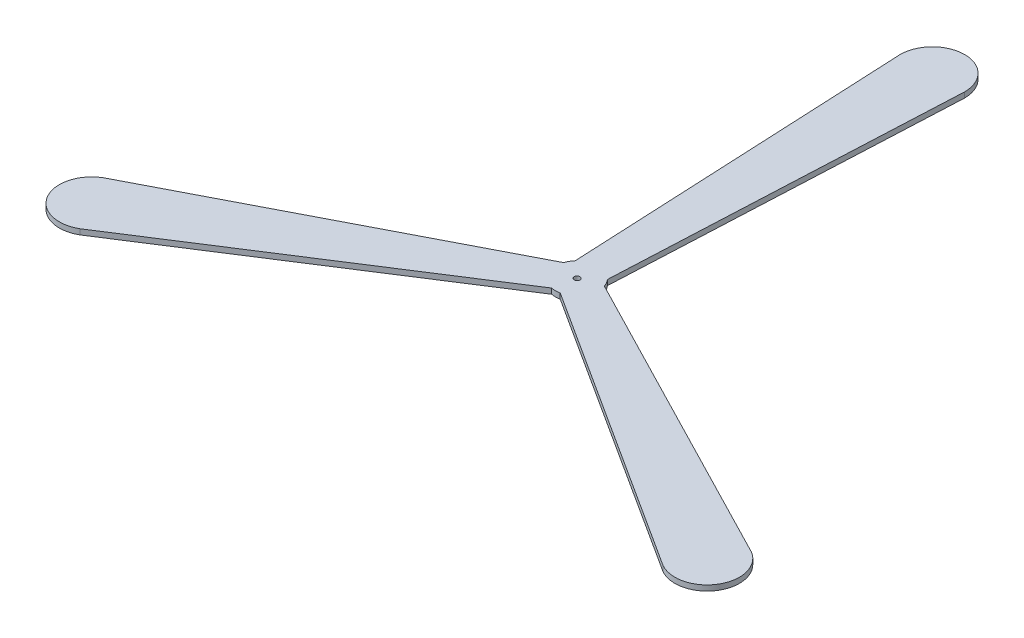
ISO-10303-21;
HEADER;
FILE_DESCRIPTION(('STEP AP214'),'2;1');
FILE_NAME('part.step','',(''),(''),'','','');
FILE_SCHEMA(('AUTOMOTIVE_DESIGN { 1 0 10303 214 1 1 1 1 }'));
ENDSEC;
DATA;
#1=APPLICATION_CONTEXT('core data for automotive mechanical design processes');
#2=APPLICATION_PROTOCOL_DEFINITION('international standard','automotive_design',2000,#1);
#3=PRODUCT_CONTEXT('',#1,'mechanical');
#4=PRODUCT('Part','Part','',(#3));
#5=PRODUCT_RELATED_PRODUCT_CATEGORY('part','',(#4));
#6=PRODUCT_DEFINITION_FORMATION('','',#4);
#7=PRODUCT_DEFINITION_CONTEXT('part definition',#1,'design');
#8=PRODUCT_DEFINITION('design','',#6,#7);
#9=PRODUCT_DEFINITION_SHAPE('','',#8);
#10=(LENGTH_UNIT() NAMED_UNIT(*) SI_UNIT(.MILLI.,.METRE.));
#11=(NAMED_UNIT(*) PLANE_ANGLE_UNIT() SI_UNIT($,.RADIAN.));
#12=(NAMED_UNIT(*) SI_UNIT($,.STERADIAN.) SOLID_ANGLE_UNIT());
#13=UNCERTAINTY_MEASURE_WITH_UNIT(LENGTH_MEASURE(1.E-05),#10,'distance_accuracy_value','');
#14=(GEOMETRIC_REPRESENTATION_CONTEXT(3) GLOBAL_UNCERTAINTY_ASSIGNED_CONTEXT((#13)) GLOBAL_UNIT_ASSIGNED_CONTEXT((#10,
#11,#12)) REPRESENTATION_CONTEXT('',''));
#15=CARTESIAN_POINT('',(0.,0.,0.));
#16=DIRECTION('',(0.,0.,1.));
#17=DIRECTION('',(1.,0.,0.));
#18=AXIS2_PLACEMENT_3D('',#15,#16,#17);
#19=CARTESIAN_POINT('',(0.,6.35,0.));
#20=DIRECTION('',(0.,1.,0.));
#21=DIRECTION('',(0.,0.,1.));
#22=AXIS2_PLACEMENT_3D('',#19,#20,#21);
#23=PLANE('',#22);
#24=CARTESIAN_POINT('',(0.,6.35,0.));
#25=DIRECTION('',(0.,1.,0.));
#26=DIRECTION('',(0.,0.,1.));
#27=AXIS2_PLACEMENT_3D('',#24,#25,#26);
#28=CIRCLE('',#27,3.3655);
#29=CARTESIAN_POINT('',(0.,6.35,3.3655));
#30=VERTEX_POINT('',#29);
#31=EDGE_CURVE('E167',#30,#30,#28,.F.);
#32=ORIENTED_EDGE('',*,*,#31,.T.);
#33=EDGE_LOOP('',(#32));
#34=FACE_BOUND('',#33,.T.);
#35=DIRECTION('',(-0.888705986742186,0.,-0.458477555752293));
#36=VECTOR('',#35,1.);
#37=CARTESIAN_POINT('',(382.001246725976,6.35,176.554432115804));
#38=LINE('',#37,#36);
#39=CARTESIAN_POINT('',(24.0746778315091,6.35,-8.09752352939111));
#40=VERTEX_POINT('',#39);
#41=CARTESIAN_POINT('',(382.001246725905,6.35,176.554432115768));
#42=VERTEX_POINT('',#41);
#43=EDGE_CURVE('E143',#40,#42,#38,.F.);
#44=ORIENTED_EDGE('',*,*,#43,.F.);
#45=CARTESIAN_POINT('',(0.,6.35,0.));
#46=DIRECTION('',(0.,1.,0.));
#47=DIRECTION('',(0.,0.,1.));
#48=AXIS2_PLACEMENT_3D('',#45,#46,#47);
#49=CIRCLE('',#48,25.4);
#50=CARTESIAN_POINT('',(19.05,6.35,-16.8005208252595));
#51=VERTEX_POINT('',#50);
#52=EDGE_CURVE('E178',#51,#40,#49,.F.);
#53=ORIENTED_EDGE('',*,*,#52,.F.);
#54=DIRECTION('',(0.0472997830245599,0.,-0.998880738890199));
#55=VECTOR('',#54,1.);
#56=CARTESIAN_POINT('',(19.05,6.35,-16.8005208252589));
#57=LINE('',#56,#55);
#58=CARTESIAN_POINT('',(38.1,6.35,-419.099999999995));
#59=VERTEX_POINT('',#58);
#60=EDGE_CURVE('E139',#59,#51,#57,.F.);
#61=ORIENTED_EDGE('',*,*,#60,.F.);
#62=CARTESIAN_POINT('',(0.,6.35,-419.1));
#63=DIRECTION('',(0.,1.,0.));
#64=DIRECTION('',(0.,0.,1.));
#65=AXIS2_PLACEMENT_3D('',#62,#63,#64);
#66=CIRCLE('',#65,38.1);
#67=CARTESIAN_POINT('',(-38.1,6.35,-419.1));
#68=VERTEX_POINT('',#67);
#69=EDGE_CURVE('E176',#68,#59,#66,.F.);
#70=ORIENTED_EDGE('',*,*,#69,.F.);
#71=DIRECTION('',(0.0472997830245599,0.,0.998880738890199));
#72=VECTOR('',#71,1.);
#73=CARTESIAN_POINT('',(-38.1,6.35,-419.1));
#74=LINE('',#73,#72);
#75=CARTESIAN_POINT('',(-19.0499999999995,6.35,-16.8005208252607));
#76=VERTEX_POINT('',#75);
#77=EDGE_CURVE('E135',#76,#68,#74,.F.);
#78=ORIENTED_EDGE('',*,*,#77,.F.);
#79=CARTESIAN_POINT('',(0.,6.35,0.));
#80=DIRECTION('',(0.,1.,0.));
#81=DIRECTION('',(0.,0.,1.));
#82=AXIS2_PLACEMENT_3D('',#79,#80,#81);
#83=CIRCLE('',#82,25.4);
#84=CARTESIAN_POINT('',(-24.0746778314848,6.35,-8.0975235294649));
#85=VERTEX_POINT('',#84);
#86=EDGE_CURVE('E134',#85,#76,#83,.F.);
#87=ORIENTED_EDGE('',*,*,#86,.F.);
#88=DIRECTION('',(-0.888705986742186,0.,0.458477555752293));
#89=VECTOR('',#88,1.);
#90=CARTESIAN_POINT('',(-24.0746778314853,6.35,-8.09752352946462));
#91=LINE('',#90,#89);
#92=CARTESIAN_POINT('',(-382.001246725291,6.35,176.554432115418));
#93=VERTEX_POINT('',#92);
#94=EDGE_CURVE('E131',#93,#85,#91,.F.);
#95=ORIENTED_EDGE('',*,*,#94,.F.);
#96=CARTESIAN_POINT('',(-362.951246725976,6.35,209.55));
#97=DIRECTION('',(0.,1.,0.));
#98=DIRECTION('',(0.,0.,1.));
#99=AXIS2_PLACEMENT_3D('',#96,#97,#98);
#100=CIRCLE('',#99,38.1);
#101=CARTESIAN_POINT('',(-343.901246725909,6.35,242.545567884153));
#102=VERTEX_POINT('',#101);
#103=EDGE_CURVE('E171',#102,#93,#100,.F.);
#104=ORIENTED_EDGE('',*,*,#103,.F.);
#105=DIRECTION('',(0.841406203717584,0.,-0.54040318313789));
#106=VECTOR('',#105,1.);
#107=CARTESIAN_POINT('',(-343.901246725976,6.35,242.545567884196));
#108=LINE('',#107,#106);
#109=CARTESIAN_POINT('',(-5.02467783143171,6.35,24.8980443547338));
#110=VERTEX_POINT('',#109);
#111=EDGE_CURVE('E117',#110,#102,#108,.F.);
#112=ORIENTED_EDGE('',*,*,#111,.F.);
#113=CARTESIAN_POINT('',(0.,6.35,0.));
#114=DIRECTION('',(0.,1.,0.));
#115=DIRECTION('',(0.,0.,1.));
#116=AXIS2_PLACEMENT_3D('',#113,#114,#115);
#117=CIRCLE('',#116,25.4);
#118=CARTESIAN_POINT('',(5.02467783148528,6.35,24.8980443547235));
#119=VERTEX_POINT('',#118);
#120=EDGE_CURVE('E19',#119,#110,#117,.F.);
#121=ORIENTED_EDGE('',*,*,#120,.F.);
#122=DIRECTION('',(0.841406203717584,0.,0.54040318313789));
#123=VECTOR('',#122,1.);
#124=CARTESIAN_POINT('',(5.0246778314853,6.35,24.8980443547236));
#125=LINE('',#124,#123);
#126=CARTESIAN_POINT('',(343.901246726367,6.35,242.545567884413));
#127=VERTEX_POINT('',#126);
#128=EDGE_CURVE('E102',#127,#119,#125,.F.);
#129=ORIENTED_EDGE('',*,*,#128,.F.);
#130=CARTESIAN_POINT('',(362.951246725976,6.35,209.55));
#131=DIRECTION('',(0.,1.,0.));
#132=DIRECTION('',(0.,0.,1.));
#133=AXIS2_PLACEMENT_3D('',#130,#131,#132);
#134=CIRCLE('',#133,38.1);
#135=EDGE_CURVE('E124',#42,#127,#134,.F.);
#136=ORIENTED_EDGE('',*,*,#135,.F.);
#137=EDGE_LOOP('',(#44,#53,#61,#70,#78,#87,#95,#104,#112,#121,#129,#136));
#138=FACE_BOUND('',#137,.T.);
#139=ADVANCED_FACE('F16',(#34,#138),#23,.T.);
#140=CARTESIAN_POINT('',(0.,0.,0.));
#141=DIRECTION('',(0.,1.,0.));
#142=DIRECTION('',(0.,0.,1.));
#143=AXIS2_PLACEMENT_3D('',#140,#141,#142);
#144=CYLINDRICAL_SURFACE('',#143,25.4);
#145=CARTESIAN_POINT('',(0.,0.,0.));
#146=DIRECTION('',(0.,1.,0.));
#147=DIRECTION('',(0.,0.,1.));
#148=AXIS2_PLACEMENT_3D('',#145,#146,#147);
#149=CIRCLE('',#148,25.4);
#150=CARTESIAN_POINT('',(-5.02467783142941,0.,24.8980443547343));
#151=VERTEX_POINT('',#150);
#152=CARTESIAN_POINT('',(5.02467783148528,0.,24.8980443547235));
#153=VERTEX_POINT('',#152);
#154=EDGE_CURVE('E123',#151,#153,#149,.T.);
#155=ORIENTED_EDGE('',*,*,#154,.T.);
#156=DIRECTION('',(0.,1.,0.));
#157=VECTOR('',#156,1.);
#158=CARTESIAN_POINT('',(5.0246778314853,0.,24.8980443547236));
#159=LINE('',#158,#157);
#160=EDGE_CURVE('E107',#119,#153,#159,.F.);
#161=ORIENTED_EDGE('',*,*,#160,.F.);
#162=ORIENTED_EDGE('',*,*,#120,.T.);
#163=DIRECTION('',(0.,1.,0.));
#164=VECTOR('',#163,1.);
#165=CARTESIAN_POINT('',(-5.02467783143112,0.,24.8980443547335));
#166=LINE('',#165,#164);
#167=EDGE_CURVE('E170',#151,#110,#166,.T.);
#168=ORIENTED_EDGE('',*,*,#167,.F.);
#169=EDGE_LOOP('',(#155,#161,#162,#168));
#170=FACE_BOUND('',#169,.T.);
#171=ADVANCED_FACE('F122',(#170),#144,.T.);
#172=CARTESIAN_POINT('',(5.0246778314853,0.,24.8980443547236));
#173=DIRECTION('',(-0.54040318313789,0.,0.841406203717584));
#174=DIRECTION('',(0.841406203717584,0.,0.54040318313789));
#175=AXIS2_PLACEMENT_3D('',#172,#173,#174);
#176=PLANE('',#175);
#177=ORIENTED_EDGE('',*,*,#160,.T.);
#178=DIRECTION('',(0.841406203717534,0.,0.540403183137968));
#179=VECTOR('',#178,1.);
#180=CARTESIAN_POINT('',(5.0246778314853,0.,24.8980443547236));
#181=LINE('',#180,#179);
#182=CARTESIAN_POINT('',(343.901246726022,0.,242.545567884214));
#183=VERTEX_POINT('',#182);
#184=EDGE_CURVE('E165',#153,#183,#181,.T.);
#185=ORIENTED_EDGE('',*,*,#184,.T.);
#186=DIRECTION('',(0.,1.,0.));
#187=VECTOR('',#186,1.);
#188=CARTESIAN_POINT('',(343.901246726203,0.,242.545567884318));
#189=LINE('',#188,#187);
#190=EDGE_CURVE('E109',#127,#183,#189,.F.);
#191=ORIENTED_EDGE('',*,*,#190,.F.);
#192=ORIENTED_EDGE('',*,*,#128,.T.);
#193=EDGE_LOOP('',(#177,#185,#191,#192));
#194=FACE_BOUND('',#193,.T.);
#195=ADVANCED_FACE('F104',(#194),#176,.T.);
#196=CARTESIAN_POINT('',(362.951246725976,0.,209.55));
#197=DIRECTION('',(0.,1.,0.));
#198=DIRECTION('',(0.,0.,1.));
#199=AXIS2_PLACEMENT_3D('',#196,#197,#198);
#200=CYLINDRICAL_SURFACE('',#199,38.1);
#201=ORIENTED_EDGE('',*,*,#190,.T.);
#202=CARTESIAN_POINT('',(362.951246725976,0.,209.55));
#203=DIRECTION('',(0.,1.,0.));
#204=DIRECTION('',(0.,0.,1.));
#205=AXIS2_PLACEMENT_3D('',#202,#203,#204);
#206=CIRCLE('',#205,38.1);
#207=CARTESIAN_POINT('',(382.001246725699,0.,176.554432115648));
#208=VERTEX_POINT('',#207);
#209=EDGE_CURVE('E162',#183,#208,#206,.T.);
#210=ORIENTED_EDGE('',*,*,#209,.T.);
#211=DIRECTION('',(0.,1.,0.));
#212=VECTOR('',#211,1.);
#213=CARTESIAN_POINT('',(382.001246725976,0.,176.554432115804));
#214=LINE('',#213,#212);
#215=EDGE_CURVE('E144',#42,#208,#214,.F.);
#216=ORIENTED_EDGE('',*,*,#215,.F.);
#217=ORIENTED_EDGE('',*,*,#135,.T.);
#218=EDGE_LOOP('',(#201,#210,#216,#217));
#219=FACE_BOUND('',#218,.T.);
#220=ADVANCED_FACE('F240',(#219),#200,.T.);
#221=CARTESIAN_POINT('',(382.001246725976,0.,176.554432115804));
#222=DIRECTION('',(0.458477555752293,0.,-0.888705986742186));
#223=DIRECTION('',(-0.888705986742186,0.,-0.458477555752293));
#224=AXIS2_PLACEMENT_3D('',#221,#222,#223);
#225=PLANE('',#224);
#226=DIRECTION('',(-0.888705986742192,0.,-0.458477555752281));
#227=VECTOR('',#226,1.);
#228=CARTESIAN_POINT('',(382.001246725976,0.,176.554432115779));
#229=LINE('',#228,#227);
#230=CARTESIAN_POINT('',(24.0746778315052,0.,-8.09752352940289));
#231=VERTEX_POINT('',#230);
#232=EDGE_CURVE('E161',#208,#231,#229,.T.);
#233=ORIENTED_EDGE('',*,*,#232,.T.);
#234=DIRECTION('',(0.,1.,0.));
#235=VECTOR('',#234,1.);
#236=CARTESIAN_POINT('',(24.0746778315101,0.,-8.09752352938822));
#237=LINE('',#236,#235);
#238=EDGE_CURVE('E142',#40,#231,#237,.F.);
#239=ORIENTED_EDGE('',*,*,#238,.F.);
#240=ORIENTED_EDGE('',*,*,#43,.T.);
#241=ORIENTED_EDGE('',*,*,#215,.T.);
#242=EDGE_LOOP('',(#233,#239,#240,#241));
#243=FACE_BOUND('',#242,.T.);
#244=ADVANCED_FACE('F237',(#243),#225,.T.);
#245=CARTESIAN_POINT('',(0.,0.,0.));
#246=DIRECTION('',(0.,1.,0.));
#247=DIRECTION('',(0.,0.,1.));
#248=AXIS2_PLACEMENT_3D('',#245,#246,#247);
#249=CYLINDRICAL_SURFACE('',#248,25.4);
#250=ORIENTED_EDGE('',*,*,#52,.T.);
#251=ORIENTED_EDGE('',*,*,#238,.T.);
#252=CARTESIAN_POINT('',(0.,0.,0.));
#253=DIRECTION('',(0.,1.,0.));
#254=DIRECTION('',(0.,0.,1.));
#255=AXIS2_PLACEMENT_3D('',#252,#253,#254);
#256=CIRCLE('',#255,25.4);
#257=CARTESIAN_POINT('',(19.05,0.,-16.8005208252595));
#258=VERTEX_POINT('',#257);
#259=EDGE_CURVE('E158',#231,#258,#256,.T.);
#260=ORIENTED_EDGE('',*,*,#259,.T.);
#261=DIRECTION('',(0.,1.,0.));
#262=VECTOR('',#261,1.);
#263=CARTESIAN_POINT('',(19.05,0.,-16.8005208252589));
#264=LINE('',#263,#262);
#265=EDGE_CURVE('E141',#51,#258,#264,.F.);
#266=ORIENTED_EDGE('',*,*,#265,.F.);
#267=EDGE_LOOP('',(#250,#251,#260,#266));
#268=FACE_BOUND('',#267,.T.);
#269=ADVANCED_FACE('F235',(#268),#249,.T.);
#270=CARTESIAN_POINT('',(19.05,0.,-16.8005208252589));
#271=DIRECTION('',(0.998880738890199,0.,0.0472997830245599));
#272=DIRECTION('',(0.0472997830245599,0.,-0.998880738890199));
#273=AXIS2_PLACEMENT_3D('',#270,#271,#272);
#274=PLANE('',#273);
#275=ORIENTED_EDGE('',*,*,#60,.T.);
#276=ORIENTED_EDGE('',*,*,#265,.T.);
#277=DIRECTION('',(0.0472997830245589,0.,-0.998880738890199));
#278=VECTOR('',#277,1.);
#279=CARTESIAN_POINT('',(19.05,0.,-16.8005208252589));
#280=LINE('',#279,#278);
#281=CARTESIAN_POINT('',(38.1,0.,-419.1));
#282=VERTEX_POINT('',#281);
#283=EDGE_CURVE('E157',#258,#282,#280,.T.);
#284=ORIENTED_EDGE('',*,*,#283,.T.);
#285=DIRECTION('',(0.,1.,0.));
#286=VECTOR('',#285,1.);
#287=CARTESIAN_POINT('',(38.1,0.,-419.1));
#288=LINE('',#287,#286);
#289=EDGE_CURVE('E138',#59,#282,#288,.F.);
#290=ORIENTED_EDGE('',*,*,#289,.F.);
#291=EDGE_LOOP('',(#275,#276,#284,#290));
#292=FACE_BOUND('',#291,.T.);
#293=ADVANCED_FACE('F233',(#292),#274,.T.);
#294=CARTESIAN_POINT('',(0.,0.,-419.1));
#295=DIRECTION('',(0.,1.,0.));
#296=DIRECTION('',(0.,0.,1.));
#297=AXIS2_PLACEMENT_3D('',#294,#295,#296);
#298=CYLINDRICAL_SURFACE('',#297,38.1);
#299=ORIENTED_EDGE('',*,*,#289,.T.);
#300=CARTESIAN_POINT('',(0.,0.,-419.1));
#301=DIRECTION('',(0.,1.,0.));
#302=DIRECTION('',(0.,0.,1.));
#303=AXIS2_PLACEMENT_3D('',#300,#301,#302);
#304=CIRCLE('',#303,38.1);
#305=CARTESIAN_POINT('',(-38.1,0.,-419.1));
#306=VERTEX_POINT('',#305);
#307=EDGE_CURVE('E154',#282,#306,#304,.T.);
#308=ORIENTED_EDGE('',*,*,#307,.T.);
#309=DIRECTION('',(0.,1.,0.));
#310=VECTOR('',#309,1.);
#311=CARTESIAN_POINT('',(-38.1,0.,-419.1));
#312=LINE('',#311,#310);
#313=EDGE_CURVE('E137',#68,#306,#312,.F.);
#314=ORIENTED_EDGE('',*,*,#313,.F.);
#315=ORIENTED_EDGE('',*,*,#69,.T.);
#316=EDGE_LOOP('',(#299,#308,#314,#315));
#317=FACE_BOUND('',#316,.T.);
#318=ADVANCED_FACE('F229',(#317),#298,.T.);
#319=CARTESIAN_POINT('',(-38.1,0.,-419.1));
#320=DIRECTION('',(-0.998880738890199,0.,0.0472997830245599));
#321=DIRECTION('',(0.0472997830245599,0.,0.998880738890199));
#322=AXIS2_PLACEMENT_3D('',#319,#320,#321);
#323=PLANE('',#322);
#324=DIRECTION('',(0.0472997830245589,0.,0.998880738890199));
#325=VECTOR('',#324,1.);
#326=CARTESIAN_POINT('',(-38.1,0.,-419.1));
#327=LINE('',#326,#325);
#328=CARTESIAN_POINT('',(-19.0499999999997,0.,-16.8005208252605));
#329=VERTEX_POINT('',#328);
#330=EDGE_CURVE('E153',#306,#329,#327,.T.);
#331=ORIENTED_EDGE('',*,*,#330,.T.);
#332=DIRECTION('',(0.,1.,0.));
#333=VECTOR('',#332,1.);
#334=CARTESIAN_POINT('',(-19.0499999999993,0.,-16.8005208252609));
#335=LINE('',#334,#333);
#336=EDGE_CURVE('E175',#76,#329,#335,.F.);
#337=ORIENTED_EDGE('',*,*,#336,.F.);
#338=ORIENTED_EDGE('',*,*,#77,.T.);
#339=ORIENTED_EDGE('',*,*,#313,.T.);
#340=EDGE_LOOP('',(#331,#337,#338,#339));
#341=FACE_BOUND('',#340,.T.);
#342=ADVANCED_FACE('F223',(#341),#323,.T.);
#343=CARTESIAN_POINT('',(0.,0.,0.));
#344=DIRECTION('',(0.,1.,0.));
#345=DIRECTION('',(0.,0.,1.));
#346=AXIS2_PLACEMENT_3D('',#343,#344,#345);
#347=CYLINDRICAL_SURFACE('',#346,25.4);
#348=DIRECTION('',(0.,1.,0.));
#349=VECTOR('',#348,1.);
#350=CARTESIAN_POINT('',(-24.0746778314853,0.,-8.09752352946462));
#351=LINE('',#350,#349);
#352=CARTESIAN_POINT('',(-24.0746778314848,0.,-8.0975235294649));
#353=VERTEX_POINT('',#352);
#354=EDGE_CURVE('E133',#85,#353,#351,.F.);
#355=ORIENTED_EDGE('',*,*,#354,.F.);
#356=ORIENTED_EDGE('',*,*,#86,.T.);
#357=ORIENTED_EDGE('',*,*,#336,.T.);
#358=CARTESIAN_POINT('',(0.,0.,0.));
#359=DIRECTION('',(0.,1.,0.));
#360=DIRECTION('',(0.,0.,1.));
#361=AXIS2_PLACEMENT_3D('',#358,#359,#360);
#362=CIRCLE('',#361,25.4);
#363=EDGE_CURVE('E150',#329,#353,#362,.T.);
#364=ORIENTED_EDGE('',*,*,#363,.T.);
#365=EDGE_LOOP('',(#355,#356,#357,#364));
#366=FACE_BOUND('',#365,.T.);
#367=ADVANCED_FACE('F220',(#366),#347,.T.);
#368=CARTESIAN_POINT('',(-24.0746778314853,0.,-8.09752352946462));
#369=DIRECTION('',(-0.458477555752293,0.,-0.888705986742186));
#370=DIRECTION('',(-0.888705986742186,0.,0.458477555752293));
#371=AXIS2_PLACEMENT_3D('',#368,#369,#370);
#372=PLANE('',#371);
#373=ORIENTED_EDGE('',*,*,#354,.T.);
#374=DIRECTION('',(-0.888705986742204,0.,0.458477555752259));
#375=VECTOR('',#374,1.);
#376=CARTESIAN_POINT('',(-24.0746778314853,0.,-8.09752352946462));
#377=LINE('',#376,#375);
#378=CARTESIAN_POINT('',(-382.00124672515,0.,176.554432115336));
#379=VERTEX_POINT('',#378);
#380=EDGE_CURVE('E149',#353,#379,#377,.T.);
#381=ORIENTED_EDGE('',*,*,#380,.T.);
#382=DIRECTION('',(0.,1.,0.));
#383=VECTOR('',#382,1.);
#384=CARTESIAN_POINT('',(-382.001246725705,0.,176.554432115656));
#385=LINE('',#384,#383);
#386=EDGE_CURVE('E130',#93,#379,#385,.F.);
#387=ORIENTED_EDGE('',*,*,#386,.F.);
#388=ORIENTED_EDGE('',*,*,#94,.T.);
#389=EDGE_LOOP('',(#373,#381,#387,#388));
#390=FACE_BOUND('',#389,.T.);
#391=ADVANCED_FACE('F214',(#390),#372,.T.);
#392=CARTESIAN_POINT('',(-362.951246725976,0.,209.55));
#393=DIRECTION('',(0.,1.,0.));
#394=DIRECTION('',(0.,0.,1.));
#395=AXIS2_PLACEMENT_3D('',#392,#393,#394);
#396=CYLINDRICAL_SURFACE('',#395,38.1);
#397=ORIENTED_EDGE('',*,*,#386,.T.);
#398=CARTESIAN_POINT('',(-362.951246725976,0.,209.55));
#399=DIRECTION('',(0.,1.,0.));
#400=DIRECTION('',(0.,0.,1.));
#401=AXIS2_PLACEMENT_3D('',#398,#399,#400);
#402=CIRCLE('',#401,38.1);
#403=CARTESIAN_POINT('',(-343.901246726104,0.,242.545567884266));
#404=VERTEX_POINT('',#403);
#405=EDGE_CURVE('E146',#379,#404,#402,.T.);
#406=ORIENTED_EDGE('',*,*,#405,.T.);
#407=DIRECTION('',(0.,1.,0.));
#408=VECTOR('',#407,1.);
#409=CARTESIAN_POINT('',(-343.901246725976,0.,242.545567884196));
#410=LINE('',#409,#408);
#411=EDGE_CURVE('E34',#102,#404,#410,.F.);
#412=ORIENTED_EDGE('',*,*,#411,.F.);
#413=ORIENTED_EDGE('',*,*,#103,.T.);
#414=EDGE_LOOP('',(#397,#406,#412,#413));
#415=FACE_BOUND('',#414,.T.);
#416=ADVANCED_FACE('F210',(#415),#396,.T.);
#417=CARTESIAN_POINT('',(-343.901246725976,0.,242.545567884196));
#418=DIRECTION('',(0.54040318313789,0.,0.841406203717584));
#419=DIRECTION('',(0.841406203717584,0.,-0.54040318313789));
#420=AXIS2_PLACEMENT_3D('',#417,#418,#419);
#421=PLANE('',#420);
#422=DIRECTION('',(0.841406203717617,0.,-0.540403183137838));
#423=VECTOR('',#422,1.);
#424=CARTESIAN_POINT('',(-343.901246725976,0.,242.54556788417));
#425=LINE('',#424,#423);
#426=EDGE_CURVE('E25',#404,#151,#425,.T.);
#427=ORIENTED_EDGE('',*,*,#426,.T.);
#428=ORIENTED_EDGE('',*,*,#167,.T.);
#429=ORIENTED_EDGE('',*,*,#111,.T.);
#430=ORIENTED_EDGE('',*,*,#411,.T.);
#431=EDGE_LOOP('',(#427,#428,#429,#430));
#432=FACE_BOUND('',#431,.T.);
#433=ADVANCED_FACE('F204',(#432),#421,.T.);
#434=CARTESIAN_POINT('',(0.,0.,0.));
#435=DIRECTION('',(0.,1.,0.));
#436=DIRECTION('',(0.,0.,1.));
#437=AXIS2_PLACEMENT_3D('',#434,#435,#436);
#438=CYLINDRICAL_SURFACE('',#437,3.3655);
#439=ORIENTED_EDGE('',*,*,#31,.F.);
#440=EDGE_LOOP('',(#439));
#441=FACE_BOUND('',#440,.T.);
#442=CARTESIAN_POINT('',(0.,0.,0.));
#443=DIRECTION('',(0.,1.,0.));
#444=DIRECTION('',(0.,0.,1.));
#445=AXIS2_PLACEMENT_3D('',#442,#443,#444);
#446=CIRCLE('',#445,3.3655);
#447=CARTESIAN_POINT('',(0.,0.,3.3655));
#448=VERTEX_POINT('',#447);
#449=EDGE_CURVE('E11',#448,#448,#446,.F.);
#450=ORIENTED_EDGE('',*,*,#449,.T.);
#451=EDGE_LOOP('',(#450));
#452=FACE_BOUND('',#451,.T.);
#453=ADVANCED_FACE('F251',(#441,#452),#438,.F.);
#454=CARTESIAN_POINT('',(0.,0.,0.));
#455=DIRECTION('',(0.,1.,0.));
#456=DIRECTION('',(0.,0.,1.));
#457=AXIS2_PLACEMENT_3D('',#454,#455,#456);
#458=PLANE('',#457);
#459=ORIENTED_EDGE('',*,*,#449,.F.);
#460=EDGE_LOOP('',(#459));
#461=FACE_BOUND('',#460,.T.);
#462=ORIENTED_EDGE('',*,*,#405,.F.);
#463=ORIENTED_EDGE('',*,*,#380,.F.);
#464=ORIENTED_EDGE('',*,*,#363,.F.);
#465=ORIENTED_EDGE('',*,*,#330,.F.);
#466=ORIENTED_EDGE('',*,*,#307,.F.);
#467=ORIENTED_EDGE('',*,*,#283,.F.);
#468=ORIENTED_EDGE('',*,*,#259,.F.);
#469=ORIENTED_EDGE('',*,*,#232,.F.);
#470=ORIENTED_EDGE('',*,*,#209,.F.);
#471=ORIENTED_EDGE('',*,*,#184,.F.);
#472=ORIENTED_EDGE('',*,*,#154,.F.);
#473=ORIENTED_EDGE('',*,*,#426,.F.);
#474=EDGE_LOOP('',(#462,#463,#464,#465,#466,#467,#468,#469,#470,#471,#472,#473));
#475=FACE_BOUND('',#474,.T.);
#476=ADVANCED_FACE('F207',(#461,#475),#458,.F.);
#477=CLOSED_SHELL('',(#139,#171,#195,#220,#244,#269,#293,#318,#342,#367,#391,#416,#433,#453,#476));
#478=MANIFOLD_SOLID_BREP('B1',#477);
#479=ADVANCED_BREP_SHAPE_REPRESENTATION('',(#18,#478),#14);
#480=SHAPE_DEFINITION_REPRESENTATION(#9,#479);
ENDSEC;
END-ISO-10303-21;
